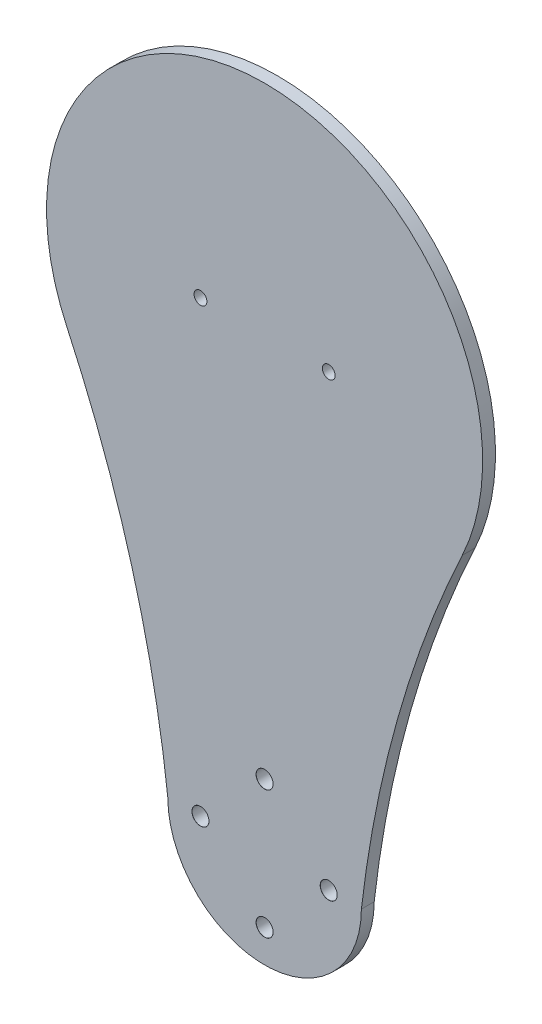
ISO-10303-21;
HEADER;
FILE_DESCRIPTION(('STEP AP214'),'2;1');
FILE_NAME('part.step','',(''),(''),'','','');
FILE_SCHEMA(('AUTOMOTIVE_DESIGN { 1 0 10303 214 1 1 1 1 }'));
ENDSEC;
DATA;
#1=APPLICATION_CONTEXT('core data for automotive mechanical design processes');
#2=APPLICATION_PROTOCOL_DEFINITION('international standard','automotive_design',2000,#1);
#3=PRODUCT_CONTEXT('',#1,'mechanical');
#4=PRODUCT('Part','Part','',(#3));
#5=PRODUCT_RELATED_PRODUCT_CATEGORY('part','',(#4));
#6=PRODUCT_DEFINITION_FORMATION('','',#4);
#7=PRODUCT_DEFINITION_CONTEXT('part definition',#1,'design');
#8=PRODUCT_DEFINITION('design','',#6,#7);
#9=PRODUCT_DEFINITION_SHAPE('','',#8);
#10=(LENGTH_UNIT() NAMED_UNIT(*) SI_UNIT(.MILLI.,.METRE.));
#11=(NAMED_UNIT(*) PLANE_ANGLE_UNIT() SI_UNIT($,.RADIAN.));
#12=(NAMED_UNIT(*) SI_UNIT($,.STERADIAN.) SOLID_ANGLE_UNIT());
#13=UNCERTAINTY_MEASURE_WITH_UNIT(LENGTH_MEASURE(1.E-05),#10,'distance_accuracy_value','');
#14=(GEOMETRIC_REPRESENTATION_CONTEXT(3) GLOBAL_UNCERTAINTY_ASSIGNED_CONTEXT((#13)) GLOBAL_UNIT_ASSIGNED_CONTEXT((#10,
#11,#12)) REPRESENTATION_CONTEXT('',''));
#15=CARTESIAN_POINT('',(0.,0.,0.));
#16=DIRECTION('',(0.,0.,1.));
#17=DIRECTION('',(1.,0.,0.));
#18=AXIS2_PLACEMENT_3D('',#15,#16,#17);
#19=CARTESIAN_POINT('',(0.,175.,5.));
#20=DIRECTION('',(0.,0.,-1.));
#21=DIRECTION('',(-1.,0.,0.));
#22=AXIS2_PLACEMENT_3D('',#19,#20,#21);
#23=CYLINDRICAL_SURFACE('',#22,85.);
#24=CARTESIAN_POINT('',(0.,175.,0.));
#25=DIRECTION('',(0.,0.,1.));
#26=DIRECTION('',(1.,0.,0.));
#27=AXIS2_PLACEMENT_3D('',#24,#25,#26);
#28=CIRCLE('',#27,85.);
#29=CARTESIAN_POINT('',(77.0496434568115,139.106373223395,0.));
#30=VERTEX_POINT('',#29);
#31=CARTESIAN_POINT('',(-77.0496434568116,139.106373223395,0.));
#32=VERTEX_POINT('',#31);
#33=EDGE_CURVE('E96',#30,#32,#28,.T.);
#34=ORIENTED_EDGE('',*,*,#33,.T.);
#35=DIRECTION('',(0.,0.,-1.));
#36=VECTOR('',#35,1.);
#37=CARTESIAN_POINT('',(-77.0496434568116,139.106373223395,5.));
#38=LINE('',#37,#36);
#39=CARTESIAN_POINT('',(-77.0496434568116,139.106373223395,5.));
#40=VERTEX_POINT('',#39);
#41=EDGE_CURVE('E11',#40,#32,#38,.T.);
#42=ORIENTED_EDGE('',*,*,#41,.F.);
#43=CARTESIAN_POINT('',(0.,175.,5.));
#44=DIRECTION('',(0.,0.,1.));
#45=DIRECTION('',(1.,0.,0.));
#46=AXIS2_PLACEMENT_3D('',#43,#44,#45);
#47=CIRCLE('',#46,85.);
#48=CARTESIAN_POINT('',(77.0496434568115,139.106373223395,5.));
#49=VERTEX_POINT('',#48);
#50=EDGE_CURVE('E84',#49,#40,#47,.T.);
#51=ORIENTED_EDGE('',*,*,#50,.F.);
#52=DIRECTION('',(0.,0.,-1.));
#53=VECTOR('',#52,1.);
#54=CARTESIAN_POINT('',(77.0496434568115,139.106373223395,5.));
#55=LINE('',#54,#53);
#56=EDGE_CURVE('E92',#49,#30,#55,.T.);
#57=ORIENTED_EDGE('',*,*,#56,.T.);
#58=EDGE_LOOP('',(#34,#42,#51,#57));
#59=FACE_BOUND('',#58,.T.);
#60=ADVANCED_FACE('F33',(#59),#23,.T.);
#61=CARTESIAN_POINT('',(-487.057576208063,-51.8960902970222,5.));
#62=DIRECTION('',(0.,0.,-1.));
#63=DIRECTION('',(-1.,0.,0.));
#64=AXIS2_PLACEMENT_3D('',#61,#62,#63);
#65=CYLINDRICAL_SURFACE('',#64,452.314543199556);
#66=CARTESIAN_POINT('',(-487.057576208063,-51.8960902970222,0.));
#67=DIRECTION('',(0.,0.,-1.));
#68=DIRECTION('',(1.,0.,0.));
#69=AXIS2_PLACEMENT_3D('',#66,#67,#68);
#70=CIRCLE('',#69,452.314543199556);
#71=CARTESIAN_POINT('',(-37.7300322029059,0.,0.));
#72=VERTEX_POINT('',#71);
#73=EDGE_CURVE('E88',#32,#72,#70,.T.);
#74=ORIENTED_EDGE('',*,*,#73,.T.);
#75=DIRECTION('',(0.,0.,-1.));
#76=VECTOR('',#75,1.);
#77=CARTESIAN_POINT('',(-37.7300322029059,0.,5.));
#78=LINE('',#77,#76);
#79=CARTESIAN_POINT('',(-37.7300322029059,0.,5.));
#80=VERTEX_POINT('',#79);
#81=EDGE_CURVE('E41',#80,#72,#78,.T.);
#82=ORIENTED_EDGE('',*,*,#81,.F.);
#83=CARTESIAN_POINT('',(-487.057576208063,-51.8960902970222,5.));
#84=DIRECTION('',(0.,0.,-1.));
#85=DIRECTION('',(1.,0.,0.));
#86=AXIS2_PLACEMENT_3D('',#83,#84,#85);
#87=CIRCLE('',#86,452.314543199556);
#88=EDGE_CURVE('E79',#40,#80,#87,.T.);
#89=ORIENTED_EDGE('',*,*,#88,.F.);
#90=ORIENTED_EDGE('',*,*,#41,.T.);
#91=EDGE_LOOP('',(#74,#82,#89,#90));
#92=FACE_BOUND('',#91,.T.);
#93=ADVANCED_FACE('F87',(#92),#65,.F.);
#94=CARTESIAN_POINT('',(0.,0.,5.));
#95=DIRECTION('',(0.,0.,-1.));
#96=DIRECTION('',(-1.,0.,0.));
#97=AXIS2_PLACEMENT_3D('',#94,#95,#96);
#98=CYLINDRICAL_SURFACE('',#97,37.7300322029059);
#99=CARTESIAN_POINT('',(0.,0.,0.));
#100=DIRECTION('',(0.,0.,1.));
#101=DIRECTION('',(1.,0.,0.));
#102=AXIS2_PLACEMENT_3D('',#99,#100,#101);
#103=CIRCLE('',#102,37.7300322029059);
#104=CARTESIAN_POINT('',(37.7300322029059,0.,0.));
#105=VERTEX_POINT('',#104);
#106=EDGE_CURVE('E66',#72,#105,#103,.T.);
#107=ORIENTED_EDGE('',*,*,#106,.T.);
#108=DIRECTION('',(0.,0.,-1.));
#109=VECTOR('',#108,1.);
#110=CARTESIAN_POINT('',(37.7300322029059,0.,5.));
#111=LINE('',#110,#109);
#112=CARTESIAN_POINT('',(37.7300322029059,0.,5.));
#113=VERTEX_POINT('',#112);
#114=EDGE_CURVE('E89',#113,#105,#111,.T.);
#115=ORIENTED_EDGE('',*,*,#114,.F.);
#116=CARTESIAN_POINT('',(0.,0.,5.));
#117=DIRECTION('',(0.,0.,1.));
#118=DIRECTION('',(1.,0.,0.));
#119=AXIS2_PLACEMENT_3D('',#116,#117,#118);
#120=CIRCLE('',#119,37.7300322029059);
#121=EDGE_CURVE('E82',#80,#113,#120,.T.);
#122=ORIENTED_EDGE('',*,*,#121,.F.);
#123=ORIENTED_EDGE('',*,*,#81,.T.);
#124=EDGE_LOOP('',(#107,#115,#122,#123));
#125=FACE_BOUND('',#124,.T.);
#126=ADVANCED_FACE('F90',(#125),#98,.T.);
#127=CARTESIAN_POINT('',(487.057576208063,-51.896090297022,5.));
#128=DIRECTION('',(0.,0.,-1.));
#129=DIRECTION('',(-1.,0.,0.));
#130=AXIS2_PLACEMENT_3D('',#127,#128,#129);
#131=CYLINDRICAL_SURFACE('',#130,452.314543199556);
#132=CARTESIAN_POINT('',(487.057576208063,-51.896090297022,0.));
#133=DIRECTION('',(0.,0.,-1.));
#134=DIRECTION('',(-1.,0.,0.));
#135=AXIS2_PLACEMENT_3D('',#132,#133,#134);
#136=CIRCLE('',#135,452.314543199556);
#137=EDGE_CURVE('E72',#105,#30,#136,.T.);
#138=ORIENTED_EDGE('',*,*,#137,.T.);
#139=ORIENTED_EDGE('',*,*,#56,.F.);
#140=CARTESIAN_POINT('',(487.057576208063,-51.896090297022,5.));
#141=DIRECTION('',(0.,0.,-1.));
#142=DIRECTION('',(-1.,0.,0.));
#143=AXIS2_PLACEMENT_3D('',#140,#141,#142);
#144=CIRCLE('',#143,452.314543199556);
#145=EDGE_CURVE('E49',#113,#49,#144,.T.);
#146=ORIENTED_EDGE('',*,*,#145,.F.);
#147=ORIENTED_EDGE('',*,*,#114,.T.);
#148=EDGE_LOOP('',(#138,#139,#146,#147));
#149=FACE_BOUND('',#148,.T.);
#150=ADVANCED_FACE('F104',(#149),#131,.F.);
#151=CARTESIAN_POINT('',(-243.528788104031,61.5519548514889,5.));
#152=DIRECTION('',(0.,0.,1.));
#153=DIRECTION('',(1.,0.,0.));
#154=AXIS2_PLACEMENT_3D('',#151,#152,#153);
#155=PLANE('',#154);
#156=CARTESIAN_POINT('',(-25.0000000000001,175.,5.));
#157=DIRECTION('',(0.,0.,1.));
#158=DIRECTION('',(1.,0.,0.));
#159=AXIS2_PLACEMENT_3D('',#156,#157,#158);
#160=CIRCLE('',#159,2.5);
#161=CARTESIAN_POINT('',(-22.5000000000001,175.,5.));
#162=VERTEX_POINT('',#161);
#163=EDGE_CURVE('E152',#162,#162,#160,.T.);
#164=ORIENTED_EDGE('',*,*,#163,.F.);
#165=EDGE_LOOP('',(#164));
#166=FACE_BOUND('',#165,.T.);
#167=CARTESIAN_POINT('',(24.9999999999999,175.,5.));
#168=DIRECTION('',(0.,0.,1.));
#169=DIRECTION('',(1.,0.,0.));
#170=AXIS2_PLACEMENT_3D('',#167,#168,#169);
#171=CIRCLE('',#170,2.5);
#172=CARTESIAN_POINT('',(27.4999999999999,175.,5.));
#173=VERTEX_POINT('',#172);
#174=EDGE_CURVE('E146',#173,#173,#171,.T.);
#175=ORIENTED_EDGE('',*,*,#174,.F.);
#176=EDGE_LOOP('',(#175));
#177=FACE_BOUND('',#176,.T.);
#178=CARTESIAN_POINT('',(0.,25.,5.));
#179=DIRECTION('',(0.,0.,1.));
#180=DIRECTION('',(1.,0.,0.));
#181=AXIS2_PLACEMENT_3D('',#178,#179,#180);
#182=CIRCLE('',#181,3.325);
#183=CARTESIAN_POINT('',(3.325,25.,5.));
#184=VERTEX_POINT('',#183);
#185=EDGE_CURVE('E142',#184,#184,#182,.T.);
#186=ORIENTED_EDGE('',*,*,#185,.F.);
#187=EDGE_LOOP('',(#186));
#188=FACE_BOUND('',#187,.T.);
#189=CARTESIAN_POINT('',(25.,0.,5.));
#190=DIRECTION('',(0.,0.,1.));
#191=DIRECTION('',(1.,0.,0.));
#192=AXIS2_PLACEMENT_3D('',#189,#190,#191);
#193=CIRCLE('',#192,3.325);
#194=CARTESIAN_POINT('',(28.325,0.,5.));
#195=VERTEX_POINT('',#194);
#196=EDGE_CURVE('E133',#195,#195,#193,.T.);
#197=ORIENTED_EDGE('',*,*,#196,.F.);
#198=EDGE_LOOP('',(#197));
#199=FACE_BOUND('',#198,.T.);
#200=CARTESIAN_POINT('',(0.,-25.,5.));
#201=DIRECTION('',(0.,0.,1.));
#202=DIRECTION('',(1.,0.,0.));
#203=AXIS2_PLACEMENT_3D('',#200,#201,#202);
#204=CIRCLE('',#203,3.325);
#205=CARTESIAN_POINT('',(3.325,-25.,5.));
#206=VERTEX_POINT('',#205);
#207=EDGE_CURVE('E124',#206,#206,#204,.T.);
#208=ORIENTED_EDGE('',*,*,#207,.F.);
#209=EDGE_LOOP('',(#208));
#210=FACE_BOUND('',#209,.T.);
#211=CARTESIAN_POINT('',(-25.,0.,5.));
#212=DIRECTION('',(0.,0.,1.));
#213=DIRECTION('',(1.,0.,0.));
#214=AXIS2_PLACEMENT_3D('',#211,#212,#213);
#215=CIRCLE('',#214,3.325);
#216=CARTESIAN_POINT('',(-21.675,0.,5.));
#217=VERTEX_POINT('',#216);
#218=EDGE_CURVE('E115',#217,#217,#215,.T.);
#219=ORIENTED_EDGE('',*,*,#218,.F.);
#220=EDGE_LOOP('',(#219));
#221=FACE_BOUND('',#220,.T.);
#222=ORIENTED_EDGE('',*,*,#50,.T.);
#223=ORIENTED_EDGE('',*,*,#88,.T.);
#224=ORIENTED_EDGE('',*,*,#121,.T.);
#225=ORIENTED_EDGE('',*,*,#145,.T.);
#226=EDGE_LOOP('',(#222,#223,#224,#225));
#227=FACE_BOUND('',#226,.T.);
#228=ADVANCED_FACE('F80',(#166,#177,#188,#199,#210,#221,#227),#155,.T.);
#229=CARTESIAN_POINT('',(-243.528788104031,61.5519548514889,0.));
#230=DIRECTION('',(0.,0.,1.));
#231=DIRECTION('',(1.,0.,0.));
#232=AXIS2_PLACEMENT_3D('',#229,#230,#231);
#233=PLANE('',#232);
#234=CARTESIAN_POINT('',(-25.0000000000001,175.,0.));
#235=DIRECTION('',(0.,0.,1.));
#236=DIRECTION('',(1.,0.,0.));
#237=AXIS2_PLACEMENT_3D('',#234,#235,#236);
#238=CIRCLE('',#237,2.5);
#239=CARTESIAN_POINT('',(-22.5000000000001,175.,0.));
#240=VERTEX_POINT('',#239);
#241=EDGE_CURVE('E145',#240,#240,#238,.T.);
#242=ORIENTED_EDGE('',*,*,#241,.T.);
#243=EDGE_LOOP('',(#242));
#244=FACE_BOUND('',#243,.T.);
#245=CARTESIAN_POINT('',(24.9999999999999,175.,0.));
#246=DIRECTION('',(0.,0.,1.));
#247=DIRECTION('',(1.,0.,0.));
#248=AXIS2_PLACEMENT_3D('',#245,#246,#247);
#249=CIRCLE('',#248,2.5);
#250=CARTESIAN_POINT('',(27.4999999999999,175.,0.));
#251=VERTEX_POINT('',#250);
#252=EDGE_CURVE('E149',#251,#251,#249,.T.);
#253=ORIENTED_EDGE('',*,*,#252,.T.);
#254=EDGE_LOOP('',(#253));
#255=FACE_BOUND('',#254,.T.);
#256=CARTESIAN_POINT('',(0.,25.,0.));
#257=DIRECTION('',(0.,0.,1.));
#258=DIRECTION('',(1.,0.,0.));
#259=AXIS2_PLACEMENT_3D('',#256,#257,#258);
#260=CIRCLE('',#259,3.3);
#261=CARTESIAN_POINT('',(3.3,25.,0.));
#262=VERTEX_POINT('',#261);
#263=EDGE_CURVE('E136',#262,#262,#260,.T.);
#264=ORIENTED_EDGE('',*,*,#263,.T.);
#265=EDGE_LOOP('',(#264));
#266=FACE_BOUND('',#265,.T.);
#267=CARTESIAN_POINT('',(25.,0.,0.));
#268=DIRECTION('',(0.,0.,1.));
#269=DIRECTION('',(1.,0.,0.));
#270=AXIS2_PLACEMENT_3D('',#267,#268,#269);
#271=CIRCLE('',#270,3.3);
#272=CARTESIAN_POINT('',(28.3,0.,0.));
#273=VERTEX_POINT('',#272);
#274=EDGE_CURVE('E127',#273,#273,#271,.T.);
#275=ORIENTED_EDGE('',*,*,#274,.T.);
#276=EDGE_LOOP('',(#275));
#277=FACE_BOUND('',#276,.T.);
#278=CARTESIAN_POINT('',(0.,-25.,0.));
#279=DIRECTION('',(0.,0.,1.));
#280=DIRECTION('',(1.,0.,0.));
#281=AXIS2_PLACEMENT_3D('',#278,#279,#280);
#282=CIRCLE('',#281,3.3);
#283=CARTESIAN_POINT('',(3.3,-25.,0.));
#284=VERTEX_POINT('',#283);
#285=EDGE_CURVE('E118',#284,#284,#282,.T.);
#286=ORIENTED_EDGE('',*,*,#285,.T.);
#287=EDGE_LOOP('',(#286));
#288=FACE_BOUND('',#287,.T.);
#289=CARTESIAN_POINT('',(-25.,0.,0.));
#290=DIRECTION('',(0.,0.,1.));
#291=DIRECTION('',(1.,0.,0.));
#292=AXIS2_PLACEMENT_3D('',#289,#290,#291);
#293=CIRCLE('',#292,3.3);
#294=CARTESIAN_POINT('',(-21.7,0.,0.));
#295=VERTEX_POINT('',#294);
#296=EDGE_CURVE('E99',#295,#295,#293,.T.);
#297=ORIENTED_EDGE('',*,*,#296,.T.);
#298=EDGE_LOOP('',(#297));
#299=FACE_BOUND('',#298,.T.);
#300=ORIENTED_EDGE('',*,*,#33,.F.);
#301=ORIENTED_EDGE('',*,*,#137,.F.);
#302=ORIENTED_EDGE('',*,*,#106,.F.);
#303=ORIENTED_EDGE('',*,*,#73,.F.);
#304=EDGE_LOOP('',(#300,#301,#302,#303));
#305=FACE_BOUND('',#304,.T.);
#306=ADVANCED_FACE('F107',(#244,#255,#266,#277,#288,#299,#305),#233,.F.);
#307=CARTESIAN_POINT('',(-25.,0.,5.));
#308=DIRECTION('',(0.,0.,1.));
#309=DIRECTION('',(1.,0.,0.));
#310=AXIS2_PLACEMENT_3D('',#307,#308,#309);
#311=CYLINDRICAL_SURFACE('',#310,3.3);
#312=ORIENTED_EDGE('',*,*,#296,.F.);
#313=EDGE_LOOP('',(#312));
#314=FACE_BOUND('',#313,.T.);
#315=CARTESIAN_POINT('',(-25.,0.,4.975));
#316=DIRECTION('',(0.,0.,1.));
#317=DIRECTION('',(1.,0.,0.));
#318=AXIS2_PLACEMENT_3D('',#315,#316,#317);
#319=CIRCLE('',#318,3.3);
#320=CARTESIAN_POINT('',(-21.7,0.,4.975));
#321=VERTEX_POINT('',#320);
#322=EDGE_CURVE('E112',#321,#321,#319,.T.);
#323=ORIENTED_EDGE('',*,*,#322,.T.);
#324=EDGE_LOOP('',(#323));
#325=FACE_BOUND('',#324,.T.);
#326=ADVANCED_FACE('F183',(#314,#325),#311,.F.);
#327=CARTESIAN_POINT('',(-25.,0.,5.));
#328=DIRECTION('',(0.,0.,1.));
#329=DIRECTION('',(1.,0.,0.));
#330=AXIS2_PLACEMENT_3D('',#327,#328,#329);
#331=CONICAL_SURFACE('',#330,3.325,0.785398163397431);
#332=ORIENTED_EDGE('',*,*,#322,.F.);
#333=EDGE_LOOP('',(#332));
#334=FACE_BOUND('',#333,.T.);
#335=ORIENTED_EDGE('',*,*,#218,.T.);
#336=EDGE_LOOP('',(#335));
#337=FACE_BOUND('',#336,.T.);
#338=ADVANCED_FACE('F180',(#334,#337),#331,.F.);
#339=CARTESIAN_POINT('',(0.,-25.,5.));
#340=DIRECTION('',(0.,0.,1.));
#341=DIRECTION('',(1.,0.,0.));
#342=AXIS2_PLACEMENT_3D('',#339,#340,#341);
#343=CYLINDRICAL_SURFACE('',#342,3.3);
#344=ORIENTED_EDGE('',*,*,#285,.F.);
#345=EDGE_LOOP('',(#344));
#346=FACE_BOUND('',#345,.T.);
#347=CARTESIAN_POINT('',(0.,-25.,4.975));
#348=DIRECTION('',(0.,0.,1.));
#349=DIRECTION('',(1.,0.,0.));
#350=AXIS2_PLACEMENT_3D('',#347,#348,#349);
#351=CIRCLE('',#350,3.3);
#352=CARTESIAN_POINT('',(3.3,-25.,4.975));
#353=VERTEX_POINT('',#352);
#354=EDGE_CURVE('E121',#353,#353,#351,.T.);
#355=ORIENTED_EDGE('',*,*,#354,.T.);
#356=EDGE_LOOP('',(#355));
#357=FACE_BOUND('',#356,.T.);
#358=ADVANCED_FACE('F182',(#346,#357),#343,.F.);
#359=CARTESIAN_POINT('',(0.,-25.,5.));
#360=DIRECTION('',(0.,0.,1.));
#361=DIRECTION('',(1.,0.,0.));
#362=AXIS2_PLACEMENT_3D('',#359,#360,#361);
#363=CONICAL_SURFACE('',#362,3.325,0.785398163397422);
#364=ORIENTED_EDGE('',*,*,#354,.F.);
#365=EDGE_LOOP('',(#364));
#366=FACE_BOUND('',#365,.T.);
#367=ORIENTED_EDGE('',*,*,#207,.T.);
#368=EDGE_LOOP('',(#367));
#369=FACE_BOUND('',#368,.T.);
#370=ADVANCED_FACE('F190',(#366,#369),#363,.F.);
#371=CARTESIAN_POINT('',(25.,0.,5.));
#372=DIRECTION('',(0.,0.,1.));
#373=DIRECTION('',(1.,0.,0.));
#374=AXIS2_PLACEMENT_3D('',#371,#372,#373);
#375=CYLINDRICAL_SURFACE('',#374,3.3);
#376=ORIENTED_EDGE('',*,*,#274,.F.);
#377=EDGE_LOOP('',(#376));
#378=FACE_BOUND('',#377,.T.);
#379=CARTESIAN_POINT('',(25.,0.,4.975));
#380=DIRECTION('',(0.,0.,1.));
#381=DIRECTION('',(1.,0.,0.));
#382=AXIS2_PLACEMENT_3D('',#379,#380,#381);
#383=CIRCLE('',#382,3.3);
#384=CARTESIAN_POINT('',(28.3,0.,4.975));
#385=VERTEX_POINT('',#384);
#386=EDGE_CURVE('E130',#385,#385,#383,.T.);
#387=ORIENTED_EDGE('',*,*,#386,.T.);
#388=EDGE_LOOP('',(#387));
#389=FACE_BOUND('',#388,.T.);
#390=ADVANCED_FACE('F250',(#378,#389),#375,.F.);
#391=CARTESIAN_POINT('',(25.,0.,5.));
#392=DIRECTION('',(0.,0.,1.));
#393=DIRECTION('',(1.,0.,0.));
#394=AXIS2_PLACEMENT_3D('',#391,#392,#393);
#395=CONICAL_SURFACE('',#394,3.325,0.785398163397431);
#396=ORIENTED_EDGE('',*,*,#386,.F.);
#397=EDGE_LOOP('',(#396));
#398=FACE_BOUND('',#397,.T.);
#399=ORIENTED_EDGE('',*,*,#196,.T.);
#400=EDGE_LOOP('',(#399));
#401=FACE_BOUND('',#400,.T.);
#402=ADVANCED_FACE('F242',(#398,#401),#395,.F.);
#403=CARTESIAN_POINT('',(0.,25.,5.));
#404=DIRECTION('',(0.,0.,1.));
#405=DIRECTION('',(1.,0.,0.));
#406=AXIS2_PLACEMENT_3D('',#403,#404,#405);
#407=CYLINDRICAL_SURFACE('',#406,3.3);
#408=ORIENTED_EDGE('',*,*,#263,.F.);
#409=EDGE_LOOP('',(#408));
#410=FACE_BOUND('',#409,.T.);
#411=CARTESIAN_POINT('',(0.,25.,4.975));
#412=DIRECTION('',(0.,0.,1.));
#413=DIRECTION('',(1.,0.,0.));
#414=AXIS2_PLACEMENT_3D('',#411,#412,#413);
#415=CIRCLE('',#414,3.3);
#416=CARTESIAN_POINT('',(3.3,25.,4.975));
#417=VERTEX_POINT('',#416);
#418=EDGE_CURVE('E139',#417,#417,#415,.T.);
#419=ORIENTED_EDGE('',*,*,#418,.T.);
#420=EDGE_LOOP('',(#419));
#421=FACE_BOUND('',#420,.T.);
#422=ADVANCED_FACE('F235',(#410,#421),#407,.F.);
#423=CARTESIAN_POINT('',(0.,25.,5.));
#424=DIRECTION('',(0.,0.,1.));
#425=DIRECTION('',(1.,0.,0.));
#426=AXIS2_PLACEMENT_3D('',#423,#424,#425);
#427=CONICAL_SURFACE('',#426,3.325,0.785398163397422);
#428=ORIENTED_EDGE('',*,*,#418,.F.);
#429=EDGE_LOOP('',(#428));
#430=FACE_BOUND('',#429,.T.);
#431=ORIENTED_EDGE('',*,*,#185,.T.);
#432=EDGE_LOOP('',(#431));
#433=FACE_BOUND('',#432,.T.);
#434=ADVANCED_FACE('F220',(#430,#433),#427,.F.);
#435=CARTESIAN_POINT('',(24.9999999999999,175.,0.));
#436=DIRECTION('',(0.,0.,1.));
#437=DIRECTION('',(1.,0.,0.));
#438=AXIS2_PLACEMENT_3D('',#435,#436,#437);
#439=CYLINDRICAL_SURFACE('',#438,2.5);
#440=ORIENTED_EDGE('',*,*,#252,.F.);
#441=EDGE_LOOP('',(#440));
#442=FACE_BOUND('',#441,.T.);
#443=ORIENTED_EDGE('',*,*,#174,.T.);
#444=EDGE_LOOP('',(#443));
#445=FACE_BOUND('',#444,.T.);
#446=ADVANCED_FACE('F163',(#442,#445),#439,.F.);
#447=CARTESIAN_POINT('',(-25.0000000000001,175.,0.));
#448=DIRECTION('',(0.,0.,1.));
#449=DIRECTION('',(1.,0.,0.));
#450=AXIS2_PLACEMENT_3D('',#447,#448,#449);
#451=CYLINDRICAL_SURFACE('',#450,2.5);
#452=ORIENTED_EDGE('',*,*,#241,.F.);
#453=EDGE_LOOP('',(#452));
#454=FACE_BOUND('',#453,.T.);
#455=ORIENTED_EDGE('',*,*,#163,.T.);
#456=EDGE_LOOP('',(#455));
#457=FACE_BOUND('',#456,.T.);
#458=ADVANCED_FACE('F160',(#454,#457),#451,.F.);
#459=CLOSED_SHELL('',(#60,#93,#126,#150,#228,#306,#326,#338,#358,#370,#390,#402,#422,#434,#446,#458));
#460=MANIFOLD_SOLID_BREP('B2',#459);
#461=ADVANCED_BREP_SHAPE_REPRESENTATION('',(#18,#460),#14);
#462=SHAPE_DEFINITION_REPRESENTATION(#9,#461);
ENDSEC;
END-ISO-10303-21;
